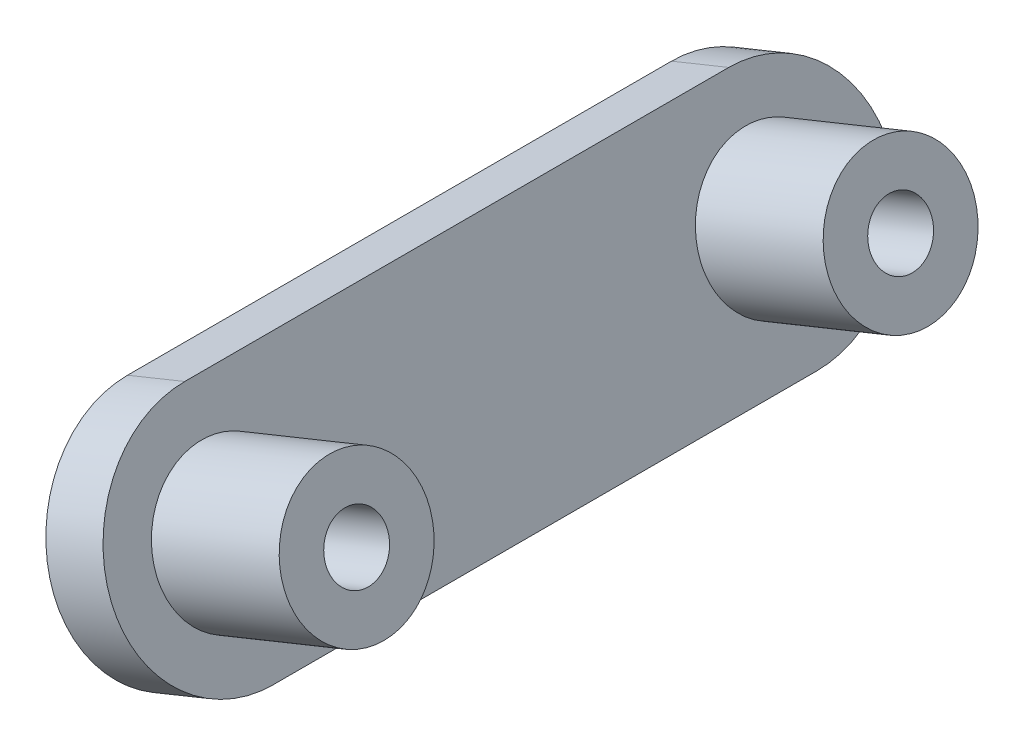
ISO-10303-21;
HEADER;
FILE_DESCRIPTION(('STEP AP214'),'2;1');
FILE_NAME('part.step','',(''),(''),'','','');
FILE_SCHEMA(('AUTOMOTIVE_DESIGN { 1 0 10303 214 1 1 1 1 }'));
ENDSEC;
DATA;
#1=APPLICATION_CONTEXT('core data for automotive mechanical design processes');
#2=APPLICATION_PROTOCOL_DEFINITION('international standard','automotive_design',2000,#1);
#3=PRODUCT_CONTEXT('',#1,'mechanical');
#4=PRODUCT('Part','Part','',(#3));
#5=PRODUCT_RELATED_PRODUCT_CATEGORY('part','',(#4));
#6=PRODUCT_DEFINITION_FORMATION('','',#4);
#7=PRODUCT_DEFINITION_CONTEXT('part definition',#1,'design');
#8=PRODUCT_DEFINITION('design','',#6,#7);
#9=PRODUCT_DEFINITION_SHAPE('','',#8);
#10=(LENGTH_UNIT() NAMED_UNIT(*) SI_UNIT(.MILLI.,.METRE.));
#11=(NAMED_UNIT(*) PLANE_ANGLE_UNIT() SI_UNIT($,.RADIAN.));
#12=(NAMED_UNIT(*) SI_UNIT($,.STERADIAN.) SOLID_ANGLE_UNIT());
#13=UNCERTAINTY_MEASURE_WITH_UNIT(LENGTH_MEASURE(1.E-05),#10,'distance_accuracy_value','');
#14=(GEOMETRIC_REPRESENTATION_CONTEXT(3) GLOBAL_UNCERTAINTY_ASSIGNED_CONTEXT((#13)) GLOBAL_UNIT_ASSIGNED_CONTEXT((#10,
#11,#12)) REPRESENTATION_CONTEXT('',''));
#15=CARTESIAN_POINT('',(0.,0.,0.));
#16=DIRECTION('',(0.,0.,1.));
#17=DIRECTION('',(1.,0.,0.));
#18=AXIS2_PLACEMENT_3D('',#15,#16,#17);
#19=CARTESIAN_POINT('',(-24.50118930469,47.261486136359,11.8));
#20=CARTESIAN_POINT('',(-31.54715946523,44.412924306818,11.8));
#21=CARTESIAN_POINT('',(-27.09795447167,53.684632613558,11.8));
#22=CARTESIAN_POINT('',(-34.14392463221,50.836070784016,11.8));
#23=CARTESIAN_POINT('',(-25.79957188818,50.473059374959,5.8));
#24=CARTESIAN_POINT('',(-32.84554204872,47.624497545417,5.8));
#25=CARTESIAN_POINT('',(-24.50118930469,47.261486136359,-0.2));
#26=CARTESIAN_POINT('',(-31.54715946523,44.412924306818,-0.2));
#27=CARTESIAN_POINT('',(-23.20280672119,44.04991289776,5.8));
#28=CARTESIAN_POINT('',(-30.24877688174,41.201351068219,5.8));
#29=CARTESIAN_POINT('',(-21.9044241377,40.838339659161,11.8));
#30=CARTESIAN_POINT('',(-28.95039429825,37.98977782962,11.8));
#31=CARTESIAN_POINT('',(-24.50118930469,47.261486136359,11.8));
#32=CARTESIAN_POINT('',(-31.54715946523,44.412924306818,11.8));
#33=(BOUNDED_SURFACE() B_SPLINE_SURFACE(2,1,((#19,#20),(#21,#22),(#23,#24),(#25,#26),(#27,#28),
(#29,#30),(#31,#32)),.UNSPECIFIED.,.T.,.F.,.F.) B_SPLINE_SURFACE_WITH_KNOTS((3,2,2,3),(2,2),(0.,
2.094395102393,4.188790204786,6.28318530718),(0.,7.6),
.UNSPECIFIED.) GEOMETRIC_REPRESENTATION_ITEM() RATIONAL_B_SPLINE_SURFACE(((1.,1.),(0.5,0.5),(1.,
1.),(0.5,0.5),(1.,1.),(0.5,0.5),(1.,1.))) REPRESENTATION_ITEM('') SURFACE());
#34=CARTESIAN_POINT('',(-31.54715946523,44.412924306818,11.8));
#35=CARTESIAN_POINT('',(-34.14392463221,50.836070784016,11.8));
#36=CARTESIAN_POINT('',(-32.84554204872,47.624497545417,5.8));
#37=CARTESIAN_POINT('',(-31.54715946523,44.412924306818,-0.2));
#38=CARTESIAN_POINT('',(-30.24877688174,41.201351068219,5.8));
#39=CARTESIAN_POINT('',(-28.95039429825,37.98977782962,11.8));
#40=CARTESIAN_POINT('',(-31.54715946523,44.412924306818,11.8));
#41=(BOUNDED_CURVE() B_SPLINE_CURVE(2,(#34,#35,#36,#37,#38,#39,#40),.UNSPECIFIED.,.T.,
.F.) B_SPLINE_CURVE_WITH_KNOTS((3,2,2,3),(0.,2.094395102393,4.188790204786,6.28318530718),
.UNSPECIFIED.) CURVE() GEOMETRIC_REPRESENTATION_ITEM() RATIONAL_B_SPLINE_CURVE((1.,0.5,1.,0.5,
1.,0.5,1.)) REPRESENTATION_ITEM(''));
#42=CARTESIAN_POINT('',(-31.54715946523,44.412924306818,11.8));
#43=VERTEX_POINT('',#42);
#44=EDGE_CURVE('E134',#43,#43,#41,.T.);
#45=CARTESIAN_POINT('',(-24.50118930469,47.261486136359,11.8));
#46=CARTESIAN_POINT('',(-31.54715946523,44.412924306818,11.8));
#47=(BOUNDED_CURVE() B_SPLINE_CURVE(1,(#45,#46),.UNSPECIFIED.,.F.,
.F.) B_SPLINE_CURVE_WITH_KNOTS((2,2),(0.,7.6),
.UNSPECIFIED.) CURVE() GEOMETRIC_REPRESENTATION_ITEM() RATIONAL_B_SPLINE_CURVE((1.,1.)) REPRESENTATION_ITEM(''));
#48=CARTESIAN_POINT('',(-24.50118930469,47.261486136359,11.8));
#49=VERTEX_POINT('',#48);
#50=EDGE_CURVE('E10',#49,#43,#47,.T.);
#51=CARTESIAN_POINT('',(-24.50118930469,47.261486136359,11.8));
#52=CARTESIAN_POINT('',(-27.09795447167,53.684632613558,11.8));
#53=CARTESIAN_POINT('',(-25.79957188818,50.473059374959,5.8));
#54=CARTESIAN_POINT('',(-24.50118930469,47.261486136359,-0.2));
#55=CARTESIAN_POINT('',(-23.20280672119,44.04991289776,5.8));
#56=CARTESIAN_POINT('',(-21.9044241377,40.838339659161,11.8));
#57=CARTESIAN_POINT('',(-24.50118930469,47.261486136359,11.8));
#58=(BOUNDED_CURVE() B_SPLINE_CURVE(2,(#51,#52,#53,#54,#55,#56,#57),.UNSPECIFIED.,.T.,
.F.) B_SPLINE_CURVE_WITH_KNOTS((3,2,2,3),(0.,2.094395102393,4.188790204786,6.28318530718),
.UNSPECIFIED.) CURVE() GEOMETRIC_REPRESENTATION_ITEM() RATIONAL_B_SPLINE_CURVE((1.,0.5,1.,0.5,
1.,0.5,1.)) REPRESENTATION_ITEM(''));
#59=EDGE_CURVE('E152',#49,#49,#58,.T.);
#60=ORIENTED_EDGE('',*,*,#44,.F.);
#61=ORIENTED_EDGE('',*,*,#50,.F.);
#62=ORIENTED_EDGE('',*,*,#59,.T.);
#63=ORIENTED_EDGE('',*,*,#50,.T.);
#64=EDGE_LOOP('',(#60,#61,#62,#63));
#65=FACE_BOUND('',#64,.T.);
#66=ADVANCED_FACE('F16',(#65),#33,.T.);
#67=CARTESIAN_POINT('',(-24.50118930469,47.261486136359,-18.2));
#68=CARTESIAN_POINT('',(-31.54715946523,44.412924306818,-18.2));
#69=CARTESIAN_POINT('',(-27.09795447167,53.684632613558,-18.2));
#70=CARTESIAN_POINT('',(-34.14392463221,50.836070784016,-18.2));
#71=CARTESIAN_POINT('',(-25.79957188818,50.473059374959,-24.2));
#72=CARTESIAN_POINT('',(-32.84554204872,47.624497545417,-24.2));
#73=CARTESIAN_POINT('',(-24.50118930469,47.261486136359,-30.2));
#74=CARTESIAN_POINT('',(-31.54715946523,44.412924306818,-30.2));
#75=CARTESIAN_POINT('',(-23.20280672119,44.04991289776,-24.2));
#76=CARTESIAN_POINT('',(-30.24877688174,41.201351068219,-24.2));
#77=CARTESIAN_POINT('',(-21.9044241377,40.838339659161,-18.2));
#78=CARTESIAN_POINT('',(-28.95039429825,37.98977782962,-18.2));
#79=CARTESIAN_POINT('',(-24.50118930469,47.261486136359,-18.2));
#80=CARTESIAN_POINT('',(-31.54715946523,44.412924306818,-18.2));
#81=(BOUNDED_SURFACE() B_SPLINE_SURFACE(2,1,((#67,#68),(#69,#70),(#71,#72),(#73,#74),(#75,#76),
(#77,#78),(#79,#80)),.UNSPECIFIED.,.T.,.F.,.F.) B_SPLINE_SURFACE_WITH_KNOTS((3,2,2,3),(2,2),(0.,
2.094395102393,4.188790204786,6.28318530718),(0.,7.6),
.UNSPECIFIED.) GEOMETRIC_REPRESENTATION_ITEM() RATIONAL_B_SPLINE_SURFACE(((1.,1.),(0.5,0.5),(1.,
1.),(0.5,0.5),(1.,1.),(0.5,0.5),(1.,1.))) REPRESENTATION_ITEM('') SURFACE());
#82=CARTESIAN_POINT('',(-31.54715946523,44.412924306818,-18.2));
#83=CARTESIAN_POINT('',(-34.14392463221,50.836070784016,-18.2));
#84=CARTESIAN_POINT('',(-32.84554204872,47.624497545417,-24.2));
#85=CARTESIAN_POINT('',(-31.54715946523,44.412924306818,-30.2));
#86=CARTESIAN_POINT('',(-30.24877688174,41.201351068219,-24.2));
#87=CARTESIAN_POINT('',(-28.95039429825,37.98977782962,-18.2));
#88=CARTESIAN_POINT('',(-31.54715946523,44.412924306818,-18.2));
#89=(BOUNDED_CURVE() B_SPLINE_CURVE(2,(#82,#83,#84,#85,#86,#87,#88),.UNSPECIFIED.,.T.,
.F.) B_SPLINE_CURVE_WITH_KNOTS((3,2,2,3),(0.,2.094395102393,4.188790204786,6.28318530718),
.UNSPECIFIED.) CURVE() GEOMETRIC_REPRESENTATION_ITEM() RATIONAL_B_SPLINE_CURVE((1.,0.5,1.,0.5,
1.,0.5,1.)) REPRESENTATION_ITEM(''));
#90=CARTESIAN_POINT('',(-31.54715946523,44.412924306818,-18.2));
#91=VERTEX_POINT('',#90);
#92=EDGE_CURVE('E111',#91,#91,#89,.T.);
#93=CARTESIAN_POINT('',(-24.50118930469,47.261486136359,-18.2));
#94=CARTESIAN_POINT('',(-31.54715946523,44.412924306818,-18.2));
#95=(BOUNDED_CURVE() B_SPLINE_CURVE(1,(#93,#94),.UNSPECIFIED.,.F.,
.F.) B_SPLINE_CURVE_WITH_KNOTS((2,2),(0.,7.6),
.UNSPECIFIED.) CURVE() GEOMETRIC_REPRESENTATION_ITEM() RATIONAL_B_SPLINE_CURVE((1.,1.)) REPRESENTATION_ITEM(''));
#96=CARTESIAN_POINT('',(-24.50118930469,47.261486136359,-18.2));
#97=VERTEX_POINT('',#96);
#98=EDGE_CURVE('E29',#97,#91,#95,.T.);
#99=CARTESIAN_POINT('',(-24.50118930469,47.261486136359,-18.2));
#100=CARTESIAN_POINT('',(-27.09795447167,53.684632613558,-18.2));
#101=CARTESIAN_POINT('',(-25.79957188818,50.473059374959,-24.2));
#102=CARTESIAN_POINT('',(-24.50118930469,47.261486136359,-30.2));
#103=CARTESIAN_POINT('',(-23.20280672119,44.04991289776,-24.2));
#104=CARTESIAN_POINT('',(-21.9044241377,40.838339659161,-18.2));
#105=CARTESIAN_POINT('',(-24.50118930469,47.261486136359,-18.2));
#106=(BOUNDED_CURVE() B_SPLINE_CURVE(2,(#99,#100,#101,#102,#103,#104,#105),.UNSPECIFIED.,.T.,
.F.) B_SPLINE_CURVE_WITH_KNOTS((3,2,2,3),(0.,2.094395102393,4.188790204786,6.28318530718),
.UNSPECIFIED.) CURVE() GEOMETRIC_REPRESENTATION_ITEM() RATIONAL_B_SPLINE_CURVE((1.,0.5,1.,0.5,
1.,0.5,1.)) REPRESENTATION_ITEM(''));
#107=EDGE_CURVE('E143',#97,#97,#106,.T.);
#108=ORIENTED_EDGE('',*,*,#92,.F.);
#109=ORIENTED_EDGE('',*,*,#98,.F.);
#110=ORIENTED_EDGE('',*,*,#107,.T.);
#111=ORIENTED_EDGE('',*,*,#98,.T.);
#112=EDGE_LOOP('',(#108,#109,#110,#111));
#113=FACE_BOUND('',#112,.T.);
#114=ADVANCED_FACE('F171',(#113),#81,.T.);
#115=CARTESIAN_POINT('',(-23.00194623651,43.553080788705,3.8));
#116=CARTESIAN_POINT('',(-26.00043237287,50.969891484014,3.8));
#117=CARTESIAN_POINT('',(-23.00194623651,43.553080788705,11.8));
#118=CARTESIAN_POINT('',(-26.00043237287,50.969891484014,11.8));
#119=(BOUNDED_SURFACE() B_SPLINE_SURFACE(1,1,((#115,#116),(#117,#118)),.UNSPECIFIED.,.F.,.F.,
.F.) B_SPLINE_SURFACE_WITH_KNOTS((2,2),(2,2),(-4.,4.),(-4.,4.),
.UNSPECIFIED.) GEOMETRIC_REPRESENTATION_ITEM() RATIONAL_B_SPLINE_SURFACE(((1.,1.),(1.,1.))) REPRESENTATION_ITEM('') SURFACE());
#120=CARTESIAN_POINT('',(-24.50118930469,47.261486136359,9.5));
#121=CARTESIAN_POINT('',(-25.60481450065,49.991323389169,9.5));
#122=CARTESIAN_POINT('',(-25.05300190267,48.626404762764,6.95));
#123=CARTESIAN_POINT('',(-24.50118930469,47.261486136359,4.4));
#124=CARTESIAN_POINT('',(-23.9493767067,45.896567509955,6.95));
#125=CARTESIAN_POINT('',(-23.39756410872,44.53164888355,9.5));
#126=CARTESIAN_POINT('',(-24.50118930469,47.261486136359,9.5));
#127=(BOUNDED_CURVE() B_SPLINE_CURVE(2,(#120,#121,#122,#123,#124,#125,#126),.UNSPECIFIED.,.T.,
.F.) B_SPLINE_CURVE_WITH_KNOTS((3,2,2,3),(0.,2.094395102393,4.188790204786,6.28318530718),
.UNSPECIFIED.) CURVE() GEOMETRIC_REPRESENTATION_ITEM() RATIONAL_B_SPLINE_CURVE((1.,0.5,1.,0.5,
1.,0.5,1.)) REPRESENTATION_ITEM(''));
#128=CARTESIAN_POINT('',(-24.50118930469,47.261486136359,9.5));
#129=VERTEX_POINT('',#128);
#130=EDGE_CURVE('E104',#129,#129,#127,.T.);
#131=ORIENTED_EDGE('',*,*,#130,.T.);
#132=EDGE_LOOP('',(#131));
#133=FACE_BOUND('',#132,.T.);
#134=ORIENTED_EDGE('',*,*,#59,.F.);
#135=EDGE_LOOP('',(#134));
#136=FACE_BOUND('',#135,.T.);
#137=ADVANCED_FACE('F358',(#133,#136),#119,.F.);
#138=CARTESIAN_POINT('',(-23.00194623651,43.553080788705,-26.2));
#139=CARTESIAN_POINT('',(-26.00043237287,50.969891484014,-26.2));
#140=CARTESIAN_POINT('',(-23.00194623651,43.553080788705,-18.2));
#141=CARTESIAN_POINT('',(-26.00043237287,50.969891484014,-18.2));
#142=(BOUNDED_SURFACE() B_SPLINE_SURFACE(1,1,((#138,#139),(#140,#141)),.UNSPECIFIED.,.F.,.F.,
.F.) B_SPLINE_SURFACE_WITH_KNOTS((2,2),(2,2),(-4.,4.),(-4.,4.),
.UNSPECIFIED.) GEOMETRIC_REPRESENTATION_ITEM() RATIONAL_B_SPLINE_SURFACE(((1.,1.),(1.,1.))) REPRESENTATION_ITEM('') SURFACE());
#143=CARTESIAN_POINT('',(-24.50118930469,47.261486136359,-20.5));
#144=CARTESIAN_POINT('',(-25.60481450065,49.991323389169,-20.5));
#145=CARTESIAN_POINT('',(-25.05300190267,48.626404762764,-23.05));
#146=CARTESIAN_POINT('',(-24.50118930469,47.261486136359,-25.6));
#147=CARTESIAN_POINT('',(-23.9493767067,45.896567509955,-23.05));
#148=CARTESIAN_POINT('',(-23.39756410872,44.53164888355,-20.5));
#149=CARTESIAN_POINT('',(-24.50118930469,47.261486136359,-20.5));
#150=(BOUNDED_CURVE() B_SPLINE_CURVE(2,(#143,#144,#145,#146,#147,#148,#149),.UNSPECIFIED.,.T.,
.F.) B_SPLINE_CURVE_WITH_KNOTS((3,2,2,3),(0.,2.094395102393,4.188790204786,6.28318530718),
.UNSPECIFIED.) CURVE() GEOMETRIC_REPRESENTATION_ITEM() RATIONAL_B_SPLINE_CURVE((1.,0.5,1.,0.5,
1.,0.5,1.)) REPRESENTATION_ITEM(''));
#151=CARTESIAN_POINT('',(-24.50118930469,47.261486136359,-20.5));
#152=VERTEX_POINT('',#151);
#153=EDGE_CURVE('E106',#152,#152,#150,.T.);
#154=ORIENTED_EDGE('',*,*,#153,.T.);
#155=EDGE_LOOP('',(#154));
#156=FACE_BOUND('',#155,.T.);
#157=ORIENTED_EDGE('',*,*,#107,.F.);
#158=EDGE_LOOP('',(#157));
#159=FACE_BOUND('',#158,.T.);
#160=ADVANCED_FACE('F177',(#156,#159),#142,.F.);
#161=CARTESIAN_POINT('',(-29.11088947944,38.386765616879,-28.7));
#162=CARTESIAN_POINT('',(-33.98342945102,50.439082996757,-28.7));
#163=CARTESIAN_POINT('',(-29.11088947944,38.386765616879,14.3));
#164=CARTESIAN_POINT('',(-33.98342945102,50.439082996757,14.3));
#165=(BOUNDED_SURFACE() B_SPLINE_SURFACE(1,1,((#161,#162),(#163,#164)),.UNSPECIFIED.,.F.,.F.,
.F.) B_SPLINE_SURFACE_WITH_KNOTS((2,2),(2,2),(-6.5,36.5),(0.,13.),
.UNSPECIFIED.) GEOMETRIC_REPRESENTATION_ITEM() RATIONAL_B_SPLINE_SURFACE(((1.,1.),(1.,1.))) REPRESENTATION_ITEM('') SURFACE());
#166=CARTESIAN_POINT('',(-33.98342945102,50.439082996757,-22.2));
#167=CARTESIAN_POINT('',(-33.98342945102,50.439082996757,-28.7));
#168=CARTESIAN_POINT('',(-31.54715946523,44.412924306818,-28.7));
#169=CARTESIAN_POINT('',(-29.11088947944,38.386765616879,-28.7));
#170=CARTESIAN_POINT('',(-29.11088947944,38.386765616879,-22.2));
#171=(BOUNDED_CURVE() B_SPLINE_CURVE(2,(#166,#167,#168,#169,#170),.UNSPECIFIED.,.F.,
.F.) B_SPLINE_CURVE_WITH_KNOTS((3,2,3),(1.570796326795,3.14159265359,4.712388980385),
.UNSPECIFIED.) CURVE() GEOMETRIC_REPRESENTATION_ITEM() RATIONAL_B_SPLINE_CURVE((1.,
0.707106781187,1.,0.707106781187,1.)) REPRESENTATION_ITEM(''));
#172=CARTESIAN_POINT('',(-33.98342945102,50.439082996757,-22.2));
#173=VERTEX_POINT('',#172);
#174=CARTESIAN_POINT('',(-29.11088947944,38.386765616879,-22.2));
#175=VERTEX_POINT('',#174);
#176=EDGE_CURVE('E182',#173,#175,#171,.T.);
#177=CARTESIAN_POINT('',(-33.98342945102,50.439082996757,-22.2));
#178=CARTESIAN_POINT('',(-33.98342945102,50.439082996757,7.8));
#179=(BOUNDED_CURVE() B_SPLINE_CURVE(1,(#177,#178),.UNSPECIFIED.,.F.,
.F.) B_SPLINE_CURVE_WITH_KNOTS((2,2),(0.,30.),
.UNSPECIFIED.) CURVE() GEOMETRIC_REPRESENTATION_ITEM() RATIONAL_B_SPLINE_CURVE((1.,1.)) REPRESENTATION_ITEM(''));
#180=CARTESIAN_POINT('',(-33.98342945102,50.439082996757,7.8));
#181=VERTEX_POINT('',#180);
#182=EDGE_CURVE('E184',#173,#181,#179,.T.);
#183=CARTESIAN_POINT('',(-33.98342945102,50.439082996757,7.8));
#184=CARTESIAN_POINT('',(-33.98342945102,50.439082996757,14.3));
#185=CARTESIAN_POINT('',(-31.54715946523,44.412924306818,14.3));
#186=CARTESIAN_POINT('',(-29.11088947944,38.386765616879,14.3));
#187=CARTESIAN_POINT('',(-29.11088947944,38.386765616879,7.8));
#188=(BOUNDED_CURVE() B_SPLINE_CURVE(2,(#183,#184,#185,#186,#187),.UNSPECIFIED.,.F.,
.F.) B_SPLINE_CURVE_WITH_KNOTS((3,2,3),(0.,1.570796326795,3.14159265359),
.UNSPECIFIED.) CURVE() GEOMETRIC_REPRESENTATION_ITEM() RATIONAL_B_SPLINE_CURVE((1.,
0.707106781187,1.,0.707106781187,1.)) REPRESENTATION_ITEM(''));
#189=CARTESIAN_POINT('',(-29.11088947944,38.386765616879,7.8));
#190=VERTEX_POINT('',#189);
#191=EDGE_CURVE('E205',#181,#190,#188,.T.);
#192=CARTESIAN_POINT('',(-29.11088947944,38.386765616879,-22.2));
#193=CARTESIAN_POINT('',(-29.11088947944,38.386765616879,7.8));
#194=(BOUNDED_CURVE() B_SPLINE_CURVE(1,(#192,#193),.UNSPECIFIED.,.F.,
.F.) B_SPLINE_CURVE_WITH_KNOTS((2,2),(0.,30.),
.UNSPECIFIED.) CURVE() GEOMETRIC_REPRESENTATION_ITEM() RATIONAL_B_SPLINE_CURVE((1.,1.)) REPRESENTATION_ITEM(''));
#195=EDGE_CURVE('E187',#175,#190,#194,.T.);
#196=ORIENTED_EDGE('',*,*,#44,.T.);
#197=EDGE_LOOP('',(#196));
#198=FACE_BOUND('',#197,.T.);
#199=ORIENTED_EDGE('',*,*,#92,.T.);
#200=EDGE_LOOP('',(#199));
#201=FACE_BOUND('',#200,.T.);
#202=ORIENTED_EDGE('',*,*,#176,.F.);
#203=ORIENTED_EDGE('',*,*,#182,.T.);
#204=ORIENTED_EDGE('',*,*,#191,.T.);
#205=ORIENTED_EDGE('',*,*,#195,.F.);
#206=EDGE_LOOP('',(#202,#203,#204,#205));
#207=FACE_BOUND('',#206,.T.);
#208=ADVANCED_FACE('F174',(#198,#201,#207),#165,.F.);
#209=CARTESIAN_POINT('',(-24.50118930469,47.261486136359,9.5));
#210=CARTESIAN_POINT('',(-34.69930401074,43.138567698865,9.5));
#211=CARTESIAN_POINT('',(-25.60481450065,49.991323389169,9.5));
#212=CARTESIAN_POINT('',(-35.8029292067,45.868404951675,9.5));
#213=CARTESIAN_POINT('',(-25.05300190267,48.626404762764,6.95));
#214=CARTESIAN_POINT('',(-35.25111660872,44.50348632527,6.95));
#215=CARTESIAN_POINT('',(-24.50118930469,47.261486136359,4.4));
#216=CARTESIAN_POINT('',(-34.69930401074,43.138567698865,4.4));
#217=CARTESIAN_POINT('',(-23.9493767067,45.896567509955,6.95));
#218=CARTESIAN_POINT('',(-34.14749141275,41.773649072461,6.95));
#219=CARTESIAN_POINT('',(-23.39756410872,44.53164888355,9.5));
#220=CARTESIAN_POINT('',(-33.59567881477,40.408730446056,9.5));
#221=CARTESIAN_POINT('',(-24.50118930469,47.261486136359,9.5));
#222=CARTESIAN_POINT('',(-34.69930401074,43.138567698865,9.5));
#223=(BOUNDED_SURFACE() B_SPLINE_SURFACE(2,1,((#209,#210),(#211,#212),(#213,#214),(#215,#216),
(#217,#218),(#219,#220),(#221,#222)),.UNSPECIFIED.,.T.,.F.,.F.) B_SPLINE_SURFACE_WITH_KNOTS((3,
2,2,3),(2,2),(0.,2.094395102393,4.188790204786,6.28318530718),(1.,12.),
.UNSPECIFIED.) GEOMETRIC_REPRESENTATION_ITEM() RATIONAL_B_SPLINE_SURFACE(((1.,1.),(0.5,0.5),(1.,
1.),(0.5,0.5),(1.,1.),(0.5,0.5),(1.,1.))) REPRESENTATION_ITEM('') SURFACE());
#224=CARTESIAN_POINT('',(-24.50118930469,47.261486136359,9.5));
#225=CARTESIAN_POINT('',(-34.69930401074,43.138567698865,9.5));
#226=(BOUNDED_CURVE() B_SPLINE_CURVE(1,(#224,#225),.UNSPECIFIED.,.F.,
.F.) B_SPLINE_CURVE_WITH_KNOTS((2,2),(1.,12.),
.UNSPECIFIED.) CURVE() GEOMETRIC_REPRESENTATION_ITEM() RATIONAL_B_SPLINE_CURVE((1.,1.)) REPRESENTATION_ITEM(''));
#227=CARTESIAN_POINT('',(-34.69930401074,43.138567698865,9.5));
#228=VERTEX_POINT('',#227);
#229=EDGE_CURVE('E100',#129,#228,#226,.T.);
#230=CARTESIAN_POINT('',(-34.69930401074,43.138567698865,9.5));
#231=CARTESIAN_POINT('',(-35.8029292067,45.868404951675,9.5));
#232=CARTESIAN_POINT('',(-35.25111660872,44.50348632527,6.95));
#233=CARTESIAN_POINT('',(-34.69930401074,43.138567698865,4.4));
#234=CARTESIAN_POINT('',(-34.14749141275,41.773649072461,6.95));
#235=CARTESIAN_POINT('',(-33.59567881477,40.408730446056,9.5));
#236=CARTESIAN_POINT('',(-34.69930401074,43.138567698865,9.5));
#237=(BOUNDED_CURVE() B_SPLINE_CURVE(2,(#230,#231,#232,#233,#234,#235,#236),.UNSPECIFIED.,.T.,
.F.) B_SPLINE_CURVE_WITH_KNOTS((3,2,2,3),(0.,2.094395102393,4.188790204786,6.28318530718),
.UNSPECIFIED.) CURVE() GEOMETRIC_REPRESENTATION_ITEM() RATIONAL_B_SPLINE_CURVE((1.,0.5,1.,0.5,
1.,0.5,1.)) REPRESENTATION_ITEM(''));
#238=EDGE_CURVE('E103',#228,#228,#237,.T.);
#239=ORIENTED_EDGE('',*,*,#229,.F.);
#240=ORIENTED_EDGE('',*,*,#130,.F.);
#241=ORIENTED_EDGE('',*,*,#229,.T.);
#242=ORIENTED_EDGE('',*,*,#238,.T.);
#243=EDGE_LOOP('',(#239,#240,#241,#242));
#244=FACE_BOUND('',#243,.T.);
#245=ADVANCED_FACE('F101',(#244),#223,.F.);
#246=CARTESIAN_POINT('',(-24.50118930469,47.261486136359,-20.5));
#247=CARTESIAN_POINT('',(-34.69930401074,43.138567698865,-20.5));
#248=CARTESIAN_POINT('',(-25.60481450065,49.991323389169,-20.5));
#249=CARTESIAN_POINT('',(-35.8029292067,45.868404951675,-20.5));
#250=CARTESIAN_POINT('',(-25.05300190267,48.626404762764,-23.05));
#251=CARTESIAN_POINT('',(-35.25111660872,44.50348632527,-23.05));
#252=CARTESIAN_POINT('',(-24.50118930469,47.261486136359,-25.6));
#253=CARTESIAN_POINT('',(-34.69930401074,43.138567698865,-25.6));
#254=CARTESIAN_POINT('',(-23.9493767067,45.896567509955,-23.05));
#255=CARTESIAN_POINT('',(-34.14749141275,41.773649072461,-23.05));
#256=CARTESIAN_POINT('',(-23.39756410872,44.53164888355,-20.5));
#257=CARTESIAN_POINT('',(-33.59567881477,40.408730446056,-20.5));
#258=CARTESIAN_POINT('',(-24.50118930469,47.261486136359,-20.5));
#259=CARTESIAN_POINT('',(-34.69930401074,43.138567698865,-20.5));
#260=(BOUNDED_SURFACE() B_SPLINE_SURFACE(2,1,((#246,#247),(#248,#249),(#250,#251),(#252,#253),
(#254,#255),(#256,#257),(#258,#259)),.UNSPECIFIED.,.T.,.F.,.F.) B_SPLINE_SURFACE_WITH_KNOTS((3,
2,2,3),(2,2),(0.,2.094395102393,4.188790204786,6.28318530718),(1.,12.),
.UNSPECIFIED.) GEOMETRIC_REPRESENTATION_ITEM() RATIONAL_B_SPLINE_SURFACE(((1.,1.),(0.5,0.5),(1.,
1.),(0.5,0.5),(1.,1.),(0.5,0.5),(1.,1.))) REPRESENTATION_ITEM('') SURFACE());
#261=CARTESIAN_POINT('',(-24.50118930469,47.261486136359,-20.5));
#262=CARTESIAN_POINT('',(-34.69930401074,43.138567698865,-20.5));
#263=(BOUNDED_CURVE() B_SPLINE_CURVE(1,(#261,#262),.UNSPECIFIED.,.F.,
.F.) B_SPLINE_CURVE_WITH_KNOTS((2,2),(1.,12.),
.UNSPECIFIED.) CURVE() GEOMETRIC_REPRESENTATION_ITEM() RATIONAL_B_SPLINE_CURVE((1.,1.)) REPRESENTATION_ITEM(''));
#264=CARTESIAN_POINT('',(-34.69930401074,43.138567698865,-20.5));
#265=VERTEX_POINT('',#264);
#266=EDGE_CURVE('E113',#152,#265,#263,.T.);
#267=CARTESIAN_POINT('',(-34.69930401074,43.138567698865,-20.5));
#268=CARTESIAN_POINT('',(-35.8029292067,45.868404951675,-20.5));
#269=CARTESIAN_POINT('',(-35.25111660872,44.50348632527,-23.05));
#270=CARTESIAN_POINT('',(-34.69930401074,43.138567698865,-25.6));
#271=CARTESIAN_POINT('',(-34.14749141275,41.773649072461,-23.05));
#272=CARTESIAN_POINT('',(-33.59567881477,40.408730446056,-20.5));
#273=CARTESIAN_POINT('',(-34.69930401074,43.138567698865,-20.5));
#274=(BOUNDED_CURVE() B_SPLINE_CURVE(2,(#267,#268,#269,#270,#271,#272,#273),.UNSPECIFIED.,.T.,
.F.) B_SPLINE_CURVE_WITH_KNOTS((3,2,2,3),(0.,2.094395102393,4.188790204786,6.28318530718),
.UNSPECIFIED.) CURVE() GEOMETRIC_REPRESENTATION_ITEM() RATIONAL_B_SPLINE_CURVE((1.,0.5,1.,0.5,
1.,0.5,1.)) REPRESENTATION_ITEM(''));
#275=EDGE_CURVE('E251',#265,#265,#274,.T.);
#276=ORIENTED_EDGE('',*,*,#266,.F.);
#277=ORIENTED_EDGE('',*,*,#153,.F.);
#278=ORIENTED_EDGE('',*,*,#266,.T.);
#279=ORIENTED_EDGE('',*,*,#275,.T.);
#280=EDGE_LOOP('',(#276,#277,#278,#279));
#281=FACE_BOUND('',#280,.T.);
#282=ADVANCED_FACE('F341',(#281),#260,.F.);
#283=CARTESIAN_POINT('',(-33.98342945102,50.439082996757,-22.2));
#284=CARTESIAN_POINT('',(-33.98342945102,50.439082996757,7.8));
#285=CARTESIAN_POINT('',(-37.13557399653,49.164726388804,-22.2));
#286=CARTESIAN_POINT('',(-37.13557399653,49.164726388804,7.8));
#287=(BOUNDED_SURFACE() B_SPLINE_SURFACE(1,1,((#283,#284),(#285,#286)),.UNSPECIFIED.,.F.,.F.,
.F.) B_SPLINE_SURFACE_WITH_KNOTS((2,2),(2,2),(0.,3.4),(0.,30.),
.UNSPECIFIED.) GEOMETRIC_REPRESENTATION_ITEM() RATIONAL_B_SPLINE_SURFACE(((1.,1.),(1.,1.))) REPRESENTATION_ITEM('') SURFACE());
#288=CARTESIAN_POINT('',(-33.98342945102,50.439082996757,-22.2));
#289=CARTESIAN_POINT('',(-37.13557399653,49.164726388804,-22.2));
#290=(BOUNDED_CURVE() B_SPLINE_CURVE(1,(#288,#289),.UNSPECIFIED.,.F.,
.F.) B_SPLINE_CURVE_WITH_KNOTS((2,2),(0.,3.4),
.UNSPECIFIED.) CURVE() GEOMETRIC_REPRESENTATION_ITEM() RATIONAL_B_SPLINE_CURVE((1.,1.)) REPRESENTATION_ITEM(''));
#291=CARTESIAN_POINT('',(-37.13557399653,49.164726388804,-22.2));
#292=VERTEX_POINT('',#291);
#293=EDGE_CURVE('E191',#173,#292,#290,.T.);
#294=CARTESIAN_POINT('',(-37.13557399653,49.164726388804,-22.2));
#295=CARTESIAN_POINT('',(-37.13557399653,49.164726388804,7.8));
#296=(BOUNDED_CURVE() B_SPLINE_CURVE(1,(#294,#295),.UNSPECIFIED.,.F.,
.F.) B_SPLINE_CURVE_WITH_KNOTS((2,2),(0.,30.),
.UNSPECIFIED.) CURVE() GEOMETRIC_REPRESENTATION_ITEM() RATIONAL_B_SPLINE_CURVE((1.,1.)) REPRESENTATION_ITEM(''));
#297=CARTESIAN_POINT('',(-37.13557399653,49.164726388804,7.8));
#298=VERTEX_POINT('',#297);
#299=EDGE_CURVE('E252',#292,#298,#296,.T.);
#300=CARTESIAN_POINT('',(-33.98342945102,50.439082996757,7.8));
#301=CARTESIAN_POINT('',(-37.13557399653,49.164726388804,7.8));
#302=(BOUNDED_CURVE() B_SPLINE_CURVE(1,(#300,#301),.UNSPECIFIED.,.F.,
.F.) B_SPLINE_CURVE_WITH_KNOTS((2,2),(0.,3.4),
.UNSPECIFIED.) CURVE() GEOMETRIC_REPRESENTATION_ITEM() RATIONAL_B_SPLINE_CURVE((1.,1.)) REPRESENTATION_ITEM(''));
#303=EDGE_CURVE('E200',#181,#298,#302,.T.);
#304=ORIENTED_EDGE('',*,*,#182,.F.);
#305=ORIENTED_EDGE('',*,*,#293,.T.);
#306=ORIENTED_EDGE('',*,*,#299,.T.);
#307=ORIENTED_EDGE('',*,*,#303,.F.);
#308=EDGE_LOOP('',(#304,#305,#306,#307));
#309=FACE_BOUND('',#308,.T.);
#310=ADVANCED_FACE('F339',(#309),#287,.T.);
#311=CARTESIAN_POINT('',(-33.98342945102,50.439082996757,-22.2));
#312=CARTESIAN_POINT('',(-37.13557399653,49.164726388804,-22.2));
#313=CARTESIAN_POINT('',(-33.98342945102,50.439082996757,-28.7));
#314=CARTESIAN_POINT('',(-37.13557399653,49.164726388804,-28.7));
#315=CARTESIAN_POINT('',(-31.54715946523,44.412924306818,-28.7));
#316=CARTESIAN_POINT('',(-34.69930401074,43.138567698865,-28.7));
#317=CARTESIAN_POINT('',(-29.11088947944,38.386765616879,-28.7));
#318=CARTESIAN_POINT('',(-32.26303402494,37.112409008926,-28.7));
#319=CARTESIAN_POINT('',(-29.11088947944,38.386765616879,-22.2));
#320=CARTESIAN_POINT('',(-32.26303402494,37.112409008926,-22.2));
#321=(BOUNDED_SURFACE() B_SPLINE_SURFACE(2,1,((#311,#312),(#313,#314),(#315,#316),(#317,#318),
(#319,#320)),.UNSPECIFIED.,.F.,.F.,.F.) B_SPLINE_SURFACE_WITH_KNOTS((3,2,3),(2,2),
(1.570796326795,3.14159265359,4.712388980385),(0.,3.4),
.UNSPECIFIED.) GEOMETRIC_REPRESENTATION_ITEM() RATIONAL_B_SPLINE_SURFACE(((1.,1.),
(0.707106781187,0.707106781187),(1.,1.),(0.707106781187,0.707106781187),(1.,1.))) REPRESENTATION_ITEM('') SURFACE());
#322=CARTESIAN_POINT('',(-37.13557399653,49.164726388804,-22.2));
#323=CARTESIAN_POINT('',(-37.13557399653,49.164726388804,-28.7));
#324=CARTESIAN_POINT('',(-34.69930401074,43.138567698865,-28.7));
#325=CARTESIAN_POINT('',(-32.26303402494,37.112409008926,-28.7));
#326=CARTESIAN_POINT('',(-32.26303402494,37.112409008926,-22.2));
#327=(BOUNDED_CURVE() B_SPLINE_CURVE(2,(#322,#323,#324,#325,#326),.UNSPECIFIED.,.F.,
.F.) B_SPLINE_CURVE_WITH_KNOTS((3,2,3),(1.570796326795,3.14159265359,4.712388980385),
.UNSPECIFIED.) CURVE() GEOMETRIC_REPRESENTATION_ITEM() RATIONAL_B_SPLINE_CURVE((1.,
0.707106781187,1.,0.707106781187,1.)) REPRESENTATION_ITEM(''));
#328=CARTESIAN_POINT('',(-32.26303402494,37.112409008926,-22.2));
#329=VERTEX_POINT('',#328);
#330=EDGE_CURVE('E195',#292,#329,#327,.T.);
#331=CARTESIAN_POINT('',(-29.11088947944,38.386765616879,-22.2));
#332=CARTESIAN_POINT('',(-32.26303402494,37.112409008926,-22.2));
#333=(BOUNDED_CURVE() B_SPLINE_CURVE(1,(#331,#332),.UNSPECIFIED.,.F.,
.F.) B_SPLINE_CURVE_WITH_KNOTS((2,2),(0.,3.4),
.UNSPECIFIED.) CURVE() GEOMETRIC_REPRESENTATION_ITEM() RATIONAL_B_SPLINE_CURVE((1.,1.)) REPRESENTATION_ITEM(''));
#334=EDGE_CURVE('E228',#175,#329,#333,.T.);
#335=ORIENTED_EDGE('',*,*,#330,.F.);
#336=ORIENTED_EDGE('',*,*,#293,.F.);
#337=ORIENTED_EDGE('',*,*,#176,.T.);
#338=ORIENTED_EDGE('',*,*,#334,.T.);
#339=EDGE_LOOP('',(#335,#336,#337,#338));
#340=FACE_BOUND('',#339,.T.);
#341=ADVANCED_FACE('F193',(#340),#321,.T.);
#342=CARTESIAN_POINT('',(-29.11088947944,38.386765616879,7.8));
#343=CARTESIAN_POINT('',(-32.26303402494,37.112409008926,7.8));
#344=CARTESIAN_POINT('',(-29.11088947944,38.386765616879,14.3));
#345=CARTESIAN_POINT('',(-32.26303402494,37.112409008926,14.3));
#346=CARTESIAN_POINT('',(-31.54715946523,44.412924306818,14.3));
#347=CARTESIAN_POINT('',(-34.69930401074,43.138567698865,14.3));
#348=CARTESIAN_POINT('',(-33.98342945102,50.439082996757,14.3));
#349=CARTESIAN_POINT('',(-37.13557399653,49.164726388804,14.3));
#350=CARTESIAN_POINT('',(-33.98342945102,50.439082996757,7.8));
#351=CARTESIAN_POINT('',(-37.13557399653,49.164726388804,7.8));
#352=(BOUNDED_SURFACE() B_SPLINE_SURFACE(2,1,((#342,#343),(#344,#345),(#346,#347),(#348,#349),
(#350,#351)),.UNSPECIFIED.,.F.,.F.,.F.) B_SPLINE_SURFACE_WITH_KNOTS((3,2,3),(2,2),
(4.712388980385,6.28318530718,7.853981633974),(0.,3.4),
.UNSPECIFIED.) GEOMETRIC_REPRESENTATION_ITEM() RATIONAL_B_SPLINE_SURFACE(((1.,1.),
(0.707106781187,0.707106781187),(1.,1.),(0.707106781187,0.707106781187),(1.,1.))) REPRESENTATION_ITEM('') SURFACE());
#353=CARTESIAN_POINT('',(-32.26303402494,37.112409008926,7.8));
#354=CARTESIAN_POINT('',(-32.26303402494,37.112409008926,14.3));
#355=CARTESIAN_POINT('',(-34.69930401074,43.138567698865,14.3));
#356=CARTESIAN_POINT('',(-37.13557399653,49.164726388804,14.3));
#357=CARTESIAN_POINT('',(-37.13557399653,49.164726388804,7.8));
#358=(BOUNDED_CURVE() B_SPLINE_CURVE(2,(#353,#354,#355,#356,#357),.UNSPECIFIED.,.F.,
.F.) B_SPLINE_CURVE_WITH_KNOTS((3,2,3),(0.,1.570796326795,3.14159265359),
.UNSPECIFIED.) CURVE() GEOMETRIC_REPRESENTATION_ITEM() RATIONAL_B_SPLINE_CURVE((1.,
0.707106781187,1.,0.707106781187,1.)) REPRESENTATION_ITEM(''));
#359=CARTESIAN_POINT('',(-32.26303402494,37.112409008926,7.8));
#360=VERTEX_POINT('',#359);
#361=EDGE_CURVE('E260',#360,#298,#358,.T.);
#362=CARTESIAN_POINT('',(-29.11088947944,38.386765616879,7.8));
#363=CARTESIAN_POINT('',(-32.26303402494,37.112409008926,7.8));
#364=(BOUNDED_CURVE() B_SPLINE_CURVE(1,(#362,#363),.UNSPECIFIED.,.F.,
.F.) B_SPLINE_CURVE_WITH_KNOTS((2,2),(0.,3.4),
.UNSPECIFIED.) CURVE() GEOMETRIC_REPRESENTATION_ITEM() RATIONAL_B_SPLINE_CURVE((1.,1.)) REPRESENTATION_ITEM(''));
#365=EDGE_CURVE('E236',#190,#360,#364,.T.);
#366=ORIENTED_EDGE('',*,*,#191,.F.);
#367=ORIENTED_EDGE('',*,*,#303,.T.);
#368=ORIENTED_EDGE('',*,*,#361,.F.);
#369=ORIENTED_EDGE('',*,*,#365,.F.);
#370=EDGE_LOOP('',(#366,#367,#368,#369));
#371=FACE_BOUND('',#370,.T.);
#372=ADVANCED_FACE('F336',(#371),#352,.T.);
#373=CARTESIAN_POINT('',(-29.11088947944,38.386765616879,-22.2));
#374=CARTESIAN_POINT('',(-29.11088947944,38.386765616879,7.8));
#375=CARTESIAN_POINT('',(-32.26303402494,37.112409008926,-22.2));
#376=CARTESIAN_POINT('',(-32.26303402494,37.112409008926,7.8));
#377=(BOUNDED_SURFACE() B_SPLINE_SURFACE(1,1,((#373,#374),(#375,#376)),.UNSPECIFIED.,.F.,.F.,
.F.) B_SPLINE_SURFACE_WITH_KNOTS((2,2),(2,2),(0.,3.4),(0.,30.),
.UNSPECIFIED.) GEOMETRIC_REPRESENTATION_ITEM() RATIONAL_B_SPLINE_SURFACE(((1.,1.),(1.,1.))) REPRESENTATION_ITEM('') SURFACE());
#378=CARTESIAN_POINT('',(-32.26303402494,37.112409008926,-22.2));
#379=CARTESIAN_POINT('',(-32.26303402494,37.112409008926,7.8));
#380=(BOUNDED_CURVE() B_SPLINE_CURVE(1,(#378,#379),.UNSPECIFIED.,.F.,
.F.) B_SPLINE_CURVE_WITH_KNOTS((2,2),(0.,30.),
.UNSPECIFIED.) CURVE() GEOMETRIC_REPRESENTATION_ITEM() RATIONAL_B_SPLINE_CURVE((1.,1.)) REPRESENTATION_ITEM(''));
#381=EDGE_CURVE('E276',#329,#360,#380,.T.);
#382=ORIENTED_EDGE('',*,*,#365,.T.);
#383=ORIENTED_EDGE('',*,*,#381,.F.);
#384=ORIENTED_EDGE('',*,*,#334,.F.);
#385=ORIENTED_EDGE('',*,*,#195,.T.);
#386=EDGE_LOOP('',(#382,#383,#384,#385));
#387=FACE_BOUND('',#386,.T.);
#388=ADVANCED_FACE('F331',(#387),#377,.F.);
#389=CARTESIAN_POINT('',(-32.26303402494,37.112409008926,-28.7));
#390=CARTESIAN_POINT('',(-37.13557399653,49.164726388804,-28.7));
#391=CARTESIAN_POINT('',(-32.26303402494,37.112409008926,14.3));
#392=CARTESIAN_POINT('',(-37.13557399653,49.164726388804,14.3));
#393=(BOUNDED_SURFACE() B_SPLINE_SURFACE(1,1,((#389,#390),(#391,#392)),.UNSPECIFIED.,.F.,.F.,
.F.) B_SPLINE_SURFACE_WITH_KNOTS((2,2),(2,2),(-6.5,36.5),(0.,13.),
.UNSPECIFIED.) GEOMETRIC_REPRESENTATION_ITEM() RATIONAL_B_SPLINE_SURFACE(((1.,1.),(1.,1.))) REPRESENTATION_ITEM('') SURFACE());
#394=ORIENTED_EDGE('',*,*,#238,.F.);
#395=EDGE_LOOP('',(#394));
#396=FACE_BOUND('',#395,.T.);
#397=ORIENTED_EDGE('',*,*,#275,.F.);
#398=EDGE_LOOP('',(#397));
#399=FACE_BOUND('',#398,.T.);
#400=ORIENTED_EDGE('',*,*,#381,.T.);
#401=ORIENTED_EDGE('',*,*,#361,.T.);
#402=ORIENTED_EDGE('',*,*,#299,.F.);
#403=ORIENTED_EDGE('',*,*,#330,.T.);
#404=EDGE_LOOP('',(#400,#401,#402,#403));
#405=FACE_BOUND('',#404,.T.);
#406=ADVANCED_FACE('F338',(#396,#399,#405),#393,.T.);
#407=CLOSED_SHELL('',(#66,#114,#137,#160,#208,#245,#282,#310,#341,#372,#388,#406));
#408=MANIFOLD_SOLID_BREP('B1',#407);
#409=ADVANCED_BREP_SHAPE_REPRESENTATION('',(#18,#408),#14);
#410=SHAPE_DEFINITION_REPRESENTATION(#9,#409);
ENDSEC;
END-ISO-10303-21;
